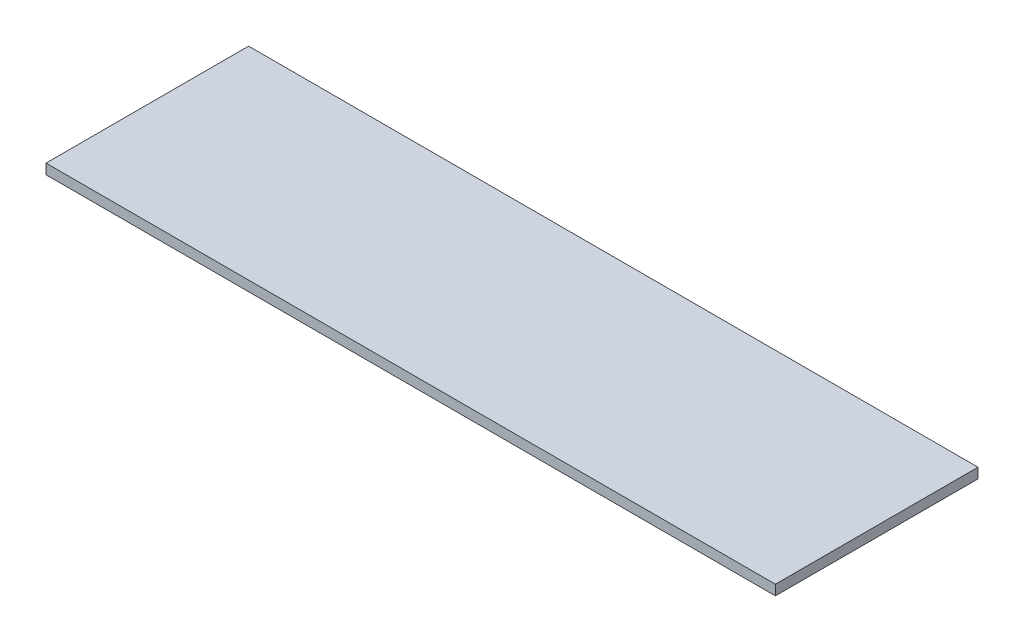
ISO-10303-21;
HEADER;
FILE_DESCRIPTION(('STEP AP214'),'2;1');
FILE_NAME('part.step','',(''),(''),'','','');
FILE_SCHEMA(('AUTOMOTIVE_DESIGN { 1 0 10303 214 1 1 1 1 }'));
ENDSEC;
DATA;
#1=APPLICATION_CONTEXT('core data for automotive mechanical design processes');
#2=APPLICATION_PROTOCOL_DEFINITION('international standard','automotive_design',2000,#1);
#3=PRODUCT_CONTEXT('',#1,'mechanical');
#4=PRODUCT('Part','Part','',(#3));
#5=PRODUCT_RELATED_PRODUCT_CATEGORY('part','',(#4));
#6=PRODUCT_DEFINITION_FORMATION('','',#4);
#7=PRODUCT_DEFINITION_CONTEXT('part definition',#1,'design');
#8=PRODUCT_DEFINITION('design','',#6,#7);
#9=PRODUCT_DEFINITION_SHAPE('','',#8);
#10=(LENGTH_UNIT() NAMED_UNIT(*) SI_UNIT(.MILLI.,.METRE.));
#11=(NAMED_UNIT(*) PLANE_ANGLE_UNIT() SI_UNIT($,.RADIAN.));
#12=(NAMED_UNIT(*) SI_UNIT($,.STERADIAN.) SOLID_ANGLE_UNIT());
#13=UNCERTAINTY_MEASURE_WITH_UNIT(LENGTH_MEASURE(1.E-05),#10,'distance_accuracy_value','');
#14=(GEOMETRIC_REPRESENTATION_CONTEXT(3) GLOBAL_UNCERTAINTY_ASSIGNED_CONTEXT((#13)) GLOBAL_UNIT_ASSIGNED_CONTEXT((#10,
#11,#12)) REPRESENTATION_CONTEXT('',''));
#15=CARTESIAN_POINT('',(0.,0.,0.));
#16=DIRECTION('',(0.,0.,1.));
#17=DIRECTION('',(1.,0.,0.));
#18=AXIS2_PLACEMENT_3D('',#15,#16,#17);
#19=CARTESIAN_POINT('',(360.,10.,100.));
#20=DIRECTION('',(-1.,0.,0.));
#21=DIRECTION('',(0.,0.,1.));
#22=AXIS2_PLACEMENT_3D('',#19,#20,#21);
#23=PLANE('',#22);
#24=DIRECTION('',(0.,0.,-1.));
#25=VECTOR('',#24,1.);
#26=CARTESIAN_POINT('',(360.,0.,100.));
#27=LINE('',#26,#25);
#28=CARTESIAN_POINT('',(360.,0.,100.));
#29=VERTEX_POINT('',#28);
#30=CARTESIAN_POINT('',(360.,0.,-100.));
#31=VERTEX_POINT('',#30);
#32=EDGE_CURVE('E96',#29,#31,#27,.T.);
#33=ORIENTED_EDGE('',*,*,#32,.T.);
#34=DIRECTION('',(0.,-1.,0.));
#35=VECTOR('',#34,1.);
#36=CARTESIAN_POINT('',(360.,10.,-100.));
#37=LINE('',#36,#35);
#38=CARTESIAN_POINT('',(360.,10.,-100.));
#39=VERTEX_POINT('',#38);
#40=EDGE_CURVE('E11',#39,#31,#37,.T.);
#41=ORIENTED_EDGE('',*,*,#40,.F.);
#42=DIRECTION('',(0.,0.,-1.));
#43=VECTOR('',#42,1.);
#44=CARTESIAN_POINT('',(360.,10.,100.));
#45=LINE('',#44,#43);
#46=CARTESIAN_POINT('',(360.,10.,100.));
#47=VERTEX_POINT('',#46);
#48=EDGE_CURVE('E84',#47,#39,#45,.T.);
#49=ORIENTED_EDGE('',*,*,#48,.F.);
#50=DIRECTION('',(0.,-1.,0.));
#51=VECTOR('',#50,1.);
#52=CARTESIAN_POINT('',(360.,10.,100.));
#53=LINE('',#52,#51);
#54=EDGE_CURVE('E92',#47,#29,#53,.T.);
#55=ORIENTED_EDGE('',*,*,#54,.T.);
#56=EDGE_LOOP('',(#33,#41,#49,#55));
#57=FACE_BOUND('',#56,.T.);
#58=ADVANCED_FACE('F33',(#57),#23,.F.);
#59=CARTESIAN_POINT('',(-360.,10.,-100.));
#60=DIRECTION('',(0.,0.,1.));
#61=DIRECTION('',(1.,0.,0.));
#62=AXIS2_PLACEMENT_3D('',#59,#60,#61);
#63=PLANE('',#62);
#64=DIRECTION('',(-1.,0.,0.));
#65=VECTOR('',#64,1.);
#66=CARTESIAN_POINT('',(-360.,0.,-100.));
#67=LINE('',#66,#65);
#68=CARTESIAN_POINT('',(-360.,0.,-100.));
#69=VERTEX_POINT('',#68);
#70=EDGE_CURVE('E88',#31,#69,#67,.T.);
#71=ORIENTED_EDGE('',*,*,#70,.T.);
#72=DIRECTION('',(0.,-1.,0.));
#73=VECTOR('',#72,1.);
#74=CARTESIAN_POINT('',(-360.,10.,-100.));
#75=LINE('',#74,#73);
#76=CARTESIAN_POINT('',(-360.,10.,-100.));
#77=VERTEX_POINT('',#76);
#78=EDGE_CURVE('E41',#77,#69,#75,.T.);
#79=ORIENTED_EDGE('',*,*,#78,.F.);
#80=DIRECTION('',(-1.,0.,0.));
#81=VECTOR('',#80,1.);
#82=CARTESIAN_POINT('',(-360.,10.,-100.));
#83=LINE('',#82,#81);
#84=EDGE_CURVE('E79',#39,#77,#83,.T.);
#85=ORIENTED_EDGE('',*,*,#84,.F.);
#86=ORIENTED_EDGE('',*,*,#40,.T.);
#87=EDGE_LOOP('',(#71,#79,#85,#86));
#88=FACE_BOUND('',#87,.T.);
#89=ADVANCED_FACE('F87',(#88),#63,.F.);
#90=CARTESIAN_POINT('',(-360.,10.,100.));
#91=DIRECTION('',(1.,0.,0.));
#92=DIRECTION('',(0.,0.,-1.));
#93=AXIS2_PLACEMENT_3D('',#90,#91,#92);
#94=PLANE('',#93);
#95=DIRECTION('',(0.,0.,1.));
#96=VECTOR('',#95,1.);
#97=CARTESIAN_POINT('',(-360.,0.,100.));
#98=LINE('',#97,#96);
#99=CARTESIAN_POINT('',(-360.,0.,100.));
#100=VERTEX_POINT('',#99);
#101=EDGE_CURVE('E66',#69,#100,#98,.T.);
#102=ORIENTED_EDGE('',*,*,#101,.T.);
#103=DIRECTION('',(0.,-1.,0.));
#104=VECTOR('',#103,1.);
#105=CARTESIAN_POINT('',(-360.,10.,100.));
#106=LINE('',#105,#104);
#107=CARTESIAN_POINT('',(-360.,10.,100.));
#108=VERTEX_POINT('',#107);
#109=EDGE_CURVE('E89',#108,#100,#106,.T.);
#110=ORIENTED_EDGE('',*,*,#109,.F.);
#111=DIRECTION('',(0.,0.,1.));
#112=VECTOR('',#111,1.);
#113=CARTESIAN_POINT('',(-360.,10.,100.));
#114=LINE('',#113,#112);
#115=EDGE_CURVE('E82',#77,#108,#114,.T.);
#116=ORIENTED_EDGE('',*,*,#115,.F.);
#117=ORIENTED_EDGE('',*,*,#78,.T.);
#118=EDGE_LOOP('',(#102,#110,#116,#117));
#119=FACE_BOUND('',#118,.T.);
#120=ADVANCED_FACE('F90',(#119),#94,.F.);
#121=CARTESIAN_POINT('',(-360.,10.,100.));
#122=DIRECTION('',(0.,0.,-1.));
#123=DIRECTION('',(-1.,0.,0.));
#124=AXIS2_PLACEMENT_3D('',#121,#122,#123);
#125=PLANE('',#124);
#126=DIRECTION('',(1.,0.,0.));
#127=VECTOR('',#126,1.);
#128=CARTESIAN_POINT('',(-360.,0.,100.));
#129=LINE('',#128,#127);
#130=EDGE_CURVE('E72',#100,#29,#129,.T.);
#131=ORIENTED_EDGE('',*,*,#130,.T.);
#132=ORIENTED_EDGE('',*,*,#54,.F.);
#133=DIRECTION('',(1.,0.,0.));
#134=VECTOR('',#133,1.);
#135=CARTESIAN_POINT('',(-360.,10.,100.));
#136=LINE('',#135,#134);
#137=EDGE_CURVE('E49',#108,#47,#136,.T.);
#138=ORIENTED_EDGE('',*,*,#137,.F.);
#139=ORIENTED_EDGE('',*,*,#109,.T.);
#140=EDGE_LOOP('',(#131,#132,#138,#139));
#141=FACE_BOUND('',#140,.T.);
#142=ADVANCED_FACE('F103',(#141),#125,.F.);
#143=CARTESIAN_POINT('',(0.,10.,0.));
#144=DIRECTION('',(0.,-1.,0.));
#145=DIRECTION('',(0.,0.,-1.));
#146=AXIS2_PLACEMENT_3D('',#143,#144,#145);
#147=PLANE('',#146);
#148=ORIENTED_EDGE('',*,*,#48,.T.);
#149=ORIENTED_EDGE('',*,*,#84,.T.);
#150=ORIENTED_EDGE('',*,*,#115,.T.);
#151=ORIENTED_EDGE('',*,*,#137,.T.);
#152=EDGE_LOOP('',(#148,#149,#150,#151));
#153=FACE_BOUND('',#152,.T.);
#154=ADVANCED_FACE('F80',(#153),#147,.F.);
#155=CARTESIAN_POINT('',(0.,0.,0.));
#156=DIRECTION('',(0.,-1.,0.));
#157=DIRECTION('',(0.,0.,-1.));
#158=AXIS2_PLACEMENT_3D('',#155,#156,#157);
#159=PLANE('',#158);
#160=ORIENTED_EDGE('',*,*,#32,.F.);
#161=ORIENTED_EDGE('',*,*,#130,.F.);
#162=ORIENTED_EDGE('',*,*,#101,.F.);
#163=ORIENTED_EDGE('',*,*,#70,.F.);
#164=EDGE_LOOP('',(#160,#161,#162,#163));
#165=FACE_BOUND('',#164,.T.);
#166=ADVANCED_FACE('F106',(#165),#159,.T.);
#167=CLOSED_SHELL('',(#58,#89,#120,#142,#154,#166));
#168=MANIFOLD_SOLID_BREP('B2',#167);
#169=ADVANCED_BREP_SHAPE_REPRESENTATION('',(#18,#168),#14);
#170=SHAPE_DEFINITION_REPRESENTATION(#9,#169);
ENDSEC;
END-ISO-10303-21;
